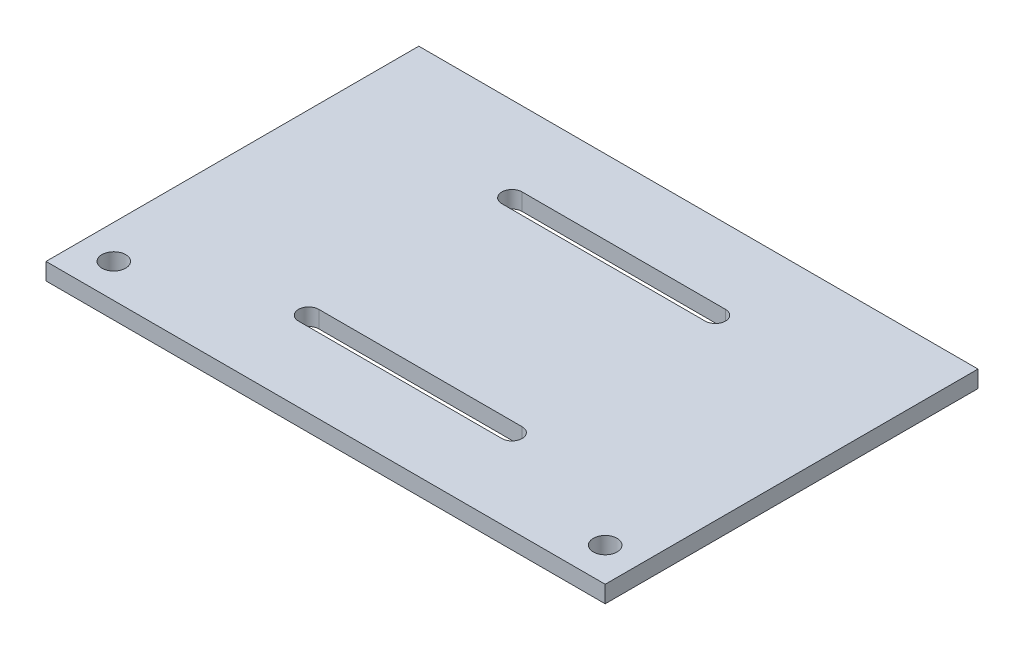
ISO-10303-21;
HEADER;
FILE_DESCRIPTION(('STEP AP214'),'2;1');
FILE_NAME('part.step','',(''),(''),'','','');
FILE_SCHEMA(('AUTOMOTIVE_DESIGN { 1 0 10303 214 1 1 1 1 }'));
ENDSEC;
DATA;
#1=APPLICATION_CONTEXT('core data for automotive mechanical design processes');
#2=APPLICATION_PROTOCOL_DEFINITION('international standard','automotive_design',2000,#1);
#3=PRODUCT_CONTEXT('',#1,'mechanical');
#4=PRODUCT('Part','Part','',(#3));
#5=PRODUCT_RELATED_PRODUCT_CATEGORY('part','',(#4));
#6=PRODUCT_DEFINITION_FORMATION('','',#4);
#7=PRODUCT_DEFINITION_CONTEXT('part definition',#1,'design');
#8=PRODUCT_DEFINITION('design','',#6,#7);
#9=PRODUCT_DEFINITION_SHAPE('','',#8);
#10=(LENGTH_UNIT() NAMED_UNIT(*) SI_UNIT(.MILLI.,.METRE.));
#11=(NAMED_UNIT(*) PLANE_ANGLE_UNIT() SI_UNIT($,.RADIAN.));
#12=(NAMED_UNIT(*) SI_UNIT($,.STERADIAN.) SOLID_ANGLE_UNIT());
#13=UNCERTAINTY_MEASURE_WITH_UNIT(LENGTH_MEASURE(1.E-05),#10,'distance_accuracy_value','');
#14=(GEOMETRIC_REPRESENTATION_CONTEXT(3) GLOBAL_UNCERTAINTY_ASSIGNED_CONTEXT((#13)) GLOBAL_UNIT_ASSIGNED_CONTEXT((#10,
#11,#12)) REPRESENTATION_CONTEXT('',''));
#15=CARTESIAN_POINT('',(0.,0.,0.));
#16=DIRECTION('',(0.,0.,1.));
#17=DIRECTION('',(1.,0.,0.));
#18=AXIS2_PLACEMENT_3D('',#15,#16,#17);
#19=CARTESIAN_POINT('',(0.,5.,0.));
#20=DIRECTION('',(0.,1.,0.));
#21=DIRECTION('',(0.,0.,1.));
#22=AXIS2_PLACEMENT_3D('',#19,#20,#21);
#23=PLANE('',#22);
#24=CARTESIAN_POINT('',(72.5,5.,45.));
#25=DIRECTION('',(0.,1.,0.));
#26=DIRECTION('',(0.,0.,1.));
#27=AXIS2_PLACEMENT_3D('',#24,#25,#26);
#28=CIRCLE('',#27,3.50000000000001);
#29=CARTESIAN_POINT('',(72.5,5.,48.5));
#30=VERTEX_POINT('',#29);
#31=EDGE_CURVE('E230',#30,#30,#28,.T.);
#32=ORIENTED_EDGE('',*,*,#31,.F.);
#33=EDGE_LOOP('',(#32));
#34=FACE_BOUND('',#33,.T.);
#35=DIRECTION('',(0.,0.,-1.));
#36=VECTOR('',#35,1.);
#37=CARTESIAN_POINT('',(82.5,5.,-55.));
#38=LINE('',#37,#36);
#39=CARTESIAN_POINT('',(82.5,5.,55.));
#40=VERTEX_POINT('',#39);
#41=CARTESIAN_POINT('',(82.5,5.,-55.));
#42=VERTEX_POINT('',#41);
#43=EDGE_CURVE('E238',#40,#42,#38,.T.);
#44=ORIENTED_EDGE('',*,*,#43,.T.);
#45=DIRECTION('',(-1.,0.,0.));
#46=VECTOR('',#45,1.);
#47=CARTESIAN_POINT('',(82.5,5.,-55.));
#48=LINE('',#47,#46);
#49=CARTESIAN_POINT('',(-82.5,5.,-55.));
#50=VERTEX_POINT('',#49);
#51=EDGE_CURVE('E242',#42,#50,#48,.T.);
#52=ORIENTED_EDGE('',*,*,#51,.T.);
#53=DIRECTION('',(0.,0.,1.));
#54=VECTOR('',#53,1.);
#55=CARTESIAN_POINT('',(-82.5,5.,-55.));
#56=LINE('',#55,#54);
#57=CARTESIAN_POINT('',(-82.5,5.,55.));
#58=VERTEX_POINT('',#57);
#59=EDGE_CURVE('E246',#50,#58,#56,.T.);
#60=ORIENTED_EDGE('',*,*,#59,.T.);
#61=DIRECTION('',(1.,0.,0.));
#62=VECTOR('',#61,1.);
#63=CARTESIAN_POINT('',(-82.5,5.,55.));
#64=LINE('',#63,#62);
#65=EDGE_CURVE('E249',#58,#40,#64,.T.);
#66=ORIENTED_EDGE('',*,*,#65,.T.);
#67=EDGE_LOOP('',(#44,#52,#60,#66));
#68=FACE_BOUND('',#67,.T.);
#69=CARTESIAN_POINT('',(-72.5,5.,45.));
#70=DIRECTION('',(0.,1.,0.));
#71=DIRECTION('',(0.,0.,1.));
#72=AXIS2_PLACEMENT_3D('',#69,#70,#71);
#73=CIRCLE('',#72,3.50000000000001);
#74=CARTESIAN_POINT('',(-72.5,5.,48.5));
#75=VERTEX_POINT('',#74);
#76=EDGE_CURVE('E222',#75,#75,#73,.T.);
#77=ORIENTED_EDGE('',*,*,#76,.F.);
#78=EDGE_LOOP('',(#77));
#79=FACE_BOUND('',#78,.T.);
#80=DIRECTION('',(-1.,0.,0.));
#81=VECTOR('',#80,1.);
#82=CARTESIAN_POINT('',(30.,5.,27.));
#83=LINE('',#82,#81);
#84=CARTESIAN_POINT('',(30.,5.,27.));
#85=VERTEX_POINT('',#84);
#86=CARTESIAN_POINT('',(-30.,5.,27.));
#87=VERTEX_POINT('',#86);
#88=EDGE_CURVE('E182',#85,#87,#83,.T.);
#89=ORIENTED_EDGE('',*,*,#88,.F.);
#90=CARTESIAN_POINT('',(30.,5.,30.));
#91=DIRECTION('',(0.,1.,0.));
#92=DIRECTION('',(0.,0.,1.));
#93=AXIS2_PLACEMENT_3D('',#90,#91,#92);
#94=CIRCLE('',#93,3.);
#95=CARTESIAN_POINT('',(30.,5.,33.));
#96=VERTEX_POINT('',#95);
#97=EDGE_CURVE('E179',#96,#85,#94,.T.);
#98=ORIENTED_EDGE('',*,*,#97,.F.);
#99=DIRECTION('',(1.,0.,0.));
#100=VECTOR('',#99,1.);
#101=CARTESIAN_POINT('',(30.,5.,33.));
#102=LINE('',#101,#100);
#103=CARTESIAN_POINT('',(-30.,5.,33.));
#104=VERTEX_POINT('',#103);
#105=EDGE_CURVE('E190',#104,#96,#102,.T.);
#106=ORIENTED_EDGE('',*,*,#105,.F.);
#107=CARTESIAN_POINT('',(-30.,5.,30.));
#108=DIRECTION('',(0.,1.,0.));
#109=DIRECTION('',(0.,0.,1.));
#110=AXIS2_PLACEMENT_3D('',#107,#108,#109);
#111=CIRCLE('',#110,3.);
#112=EDGE_CURVE('E186',#87,#104,#111,.T.);
#113=ORIENTED_EDGE('',*,*,#112,.F.);
#114=EDGE_LOOP('',(#89,#98,#106,#113));
#115=FACE_BOUND('',#114,.T.);
#116=DIRECTION('',(-1.,0.,0.));
#117=VECTOR('',#116,1.);
#118=CARTESIAN_POINT('',(30.,5.,-33.));
#119=LINE('',#118,#117);
#120=CARTESIAN_POINT('',(30.,5.,-33.));
#121=VERTEX_POINT('',#120);
#122=CARTESIAN_POINT('',(-30.,5.,-33.));
#123=VERTEX_POINT('',#122);
#124=EDGE_CURVE('E140',#121,#123,#119,.T.);
#125=ORIENTED_EDGE('',*,*,#124,.F.);
#126=CARTESIAN_POINT('',(30.,5.,-30.));
#127=DIRECTION('',(0.,1.,0.));
#128=DIRECTION('',(0.,0.,1.));
#129=AXIS2_PLACEMENT_3D('',#126,#127,#128);
#130=CIRCLE('',#129,3.00000000000001);
#131=CARTESIAN_POINT('',(30.,5.,-27.));
#132=VERTEX_POINT('',#131);
#133=EDGE_CURVE('E131',#132,#121,#130,.T.);
#134=ORIENTED_EDGE('',*,*,#133,.F.);
#135=DIRECTION('',(1.,0.,0.));
#136=VECTOR('',#135,1.);
#137=CARTESIAN_POINT('',(30.,5.,-27.));
#138=LINE('',#137,#136);
#139=CARTESIAN_POINT('',(-30.,5.,-27.));
#140=VERTEX_POINT('',#139);
#141=EDGE_CURVE('E157',#140,#132,#138,.T.);
#142=ORIENTED_EDGE('',*,*,#141,.F.);
#143=CARTESIAN_POINT('',(-30.,5.,-30.));
#144=DIRECTION('',(0.,1.,0.));
#145=DIRECTION('',(0.,0.,1.));
#146=AXIS2_PLACEMENT_3D('',#143,#144,#145);
#147=CIRCLE('',#146,3.00000000000001);
#148=EDGE_CURVE('E153',#123,#140,#147,.T.);
#149=ORIENTED_EDGE('',*,*,#148,.F.);
#150=EDGE_LOOP('',(#125,#134,#142,#149));
#151=FACE_BOUND('',#150,.T.);
#152=ADVANCED_FACE('F41',(#34,#68,#79,#115,#151),#23,.T.);
#153=CARTESIAN_POINT('',(0.,0.,0.));
#154=DIRECTION('',(0.,1.,0.));
#155=DIRECTION('',(0.,0.,1.));
#156=AXIS2_PLACEMENT_3D('',#153,#154,#155);
#157=PLANE('',#156);
#158=CARTESIAN_POINT('',(30.,0.,30.));
#159=DIRECTION('',(0.,1.,0.));
#160=DIRECTION('',(0.,0.,1.));
#161=AXIS2_PLACEMENT_3D('',#158,#159,#160);
#162=CIRCLE('',#161,3.);
#163=CARTESIAN_POINT('',(30.,0.,33.));
#164=VERTEX_POINT('',#163);
#165=CARTESIAN_POINT('',(30.,0.,27.));
#166=VERTEX_POINT('',#165);
#167=EDGE_CURVE('E149',#164,#166,#162,.T.);
#168=ORIENTED_EDGE('',*,*,#167,.T.);
#169=DIRECTION('',(-1.,0.,0.));
#170=VECTOR('',#169,1.);
#171=CARTESIAN_POINT('',(30.,0.,27.));
#172=LINE('',#171,#170);
#173=CARTESIAN_POINT('',(-30.,0.,27.));
#174=VERTEX_POINT('',#173);
#175=EDGE_CURVE('E197',#166,#174,#172,.T.);
#176=ORIENTED_EDGE('',*,*,#175,.T.);
#177=CARTESIAN_POINT('',(-30.,0.,30.));
#178=DIRECTION('',(0.,1.,0.));
#179=DIRECTION('',(0.,0.,1.));
#180=AXIS2_PLACEMENT_3D('',#177,#178,#179);
#181=CIRCLE('',#180,3.);
#182=CARTESIAN_POINT('',(-30.,0.,33.));
#183=VERTEX_POINT('',#182);
#184=EDGE_CURVE('E201',#174,#183,#181,.T.);
#185=ORIENTED_EDGE('',*,*,#184,.T.);
#186=DIRECTION('',(1.,0.,0.));
#187=VECTOR('',#186,1.);
#188=CARTESIAN_POINT('',(30.,0.,33.));
#189=LINE('',#188,#187);
#190=EDGE_CURVE('E183',#183,#164,#189,.T.);
#191=ORIENTED_EDGE('',*,*,#190,.T.);
#192=EDGE_LOOP('',(#168,#176,#185,#191));
#193=FACE_BOUND('',#192,.T.);
#194=DIRECTION('',(0.,0.,-1.));
#195=VECTOR('',#194,1.);
#196=CARTESIAN_POINT('',(82.5,0.,-55.));
#197=LINE('',#196,#195);
#198=CARTESIAN_POINT('',(82.5,0.,55.));
#199=VERTEX_POINT('',#198);
#200=CARTESIAN_POINT('',(82.5,0.,-55.));
#201=VERTEX_POINT('',#200);
#202=EDGE_CURVE('E234',#199,#201,#197,.T.);
#203=ORIENTED_EDGE('',*,*,#202,.F.);
#204=DIRECTION('',(1.,0.,0.));
#205=VECTOR('',#204,1.);
#206=CARTESIAN_POINT('',(-82.5,0.,55.));
#207=LINE('',#206,#205);
#208=CARTESIAN_POINT('',(-82.5,0.,55.));
#209=VERTEX_POINT('',#208);
#210=EDGE_CURVE('E243',#209,#199,#207,.T.);
#211=ORIENTED_EDGE('',*,*,#210,.F.);
#212=DIRECTION('',(0.,0.,1.));
#213=VECTOR('',#212,1.);
#214=CARTESIAN_POINT('',(-82.5,0.,-55.));
#215=LINE('',#214,#213);
#216=CARTESIAN_POINT('',(-82.5,0.,-55.));
#217=VERTEX_POINT('',#216);
#218=EDGE_CURVE('E259',#217,#209,#215,.T.);
#219=ORIENTED_EDGE('',*,*,#218,.F.);
#220=DIRECTION('',(-1.,0.,0.));
#221=VECTOR('',#220,1.);
#222=CARTESIAN_POINT('',(82.5,0.,-55.));
#223=LINE('',#222,#221);
#224=EDGE_CURVE('E256',#201,#217,#223,.T.);
#225=ORIENTED_EDGE('',*,*,#224,.F.);
#226=EDGE_LOOP('',(#203,#211,#219,#225));
#227=FACE_BOUND('',#226,.T.);
#228=CARTESIAN_POINT('',(72.5,0.,45.));
#229=DIRECTION('',(0.,1.,0.));
#230=DIRECTION('',(0.,0.,1.));
#231=AXIS2_PLACEMENT_3D('',#228,#229,#230);
#232=CIRCLE('',#231,3.50000000000001);
#233=CARTESIAN_POINT('',(72.5,0.,48.5));
#234=VERTEX_POINT('',#233);
#235=EDGE_CURVE('E226',#234,#234,#232,.T.);
#236=ORIENTED_EDGE('',*,*,#235,.T.);
#237=EDGE_LOOP('',(#236));
#238=FACE_BOUND('',#237,.T.);
#239=CARTESIAN_POINT('',(-72.5,0.,45.));
#240=DIRECTION('',(0.,1.,0.));
#241=DIRECTION('',(0.,0.,1.));
#242=AXIS2_PLACEMENT_3D('',#239,#240,#241);
#243=CIRCLE('',#242,3.50000000000001);
#244=CARTESIAN_POINT('',(-72.5,0.,48.5));
#245=VERTEX_POINT('',#244);
#246=EDGE_CURVE('E221',#245,#245,#243,.T.);
#247=ORIENTED_EDGE('',*,*,#246,.T.);
#248=EDGE_LOOP('',(#247));
#249=FACE_BOUND('',#248,.T.);
#250=CARTESIAN_POINT('',(30.,0.,-30.));
#251=DIRECTION('',(0.,1.,0.));
#252=DIRECTION('',(0.,0.,1.));
#253=AXIS2_PLACEMENT_3D('',#250,#251,#252);
#254=CIRCLE('',#253,3.00000000000001);
#255=CARTESIAN_POINT('',(30.,0.,-27.));
#256=VERTEX_POINT('',#255);
#257=CARTESIAN_POINT('',(30.,0.,-33.));
#258=VERTEX_POINT('',#257);
#259=EDGE_CURVE('E65',#256,#258,#254,.T.);
#260=ORIENTED_EDGE('',*,*,#259,.T.);
#261=DIRECTION('',(-1.,0.,0.));
#262=VECTOR('',#261,1.);
#263=CARTESIAN_POINT('',(30.,0.,-33.));
#264=LINE('',#263,#262);
#265=CARTESIAN_POINT('',(-30.,0.,-33.));
#266=VERTEX_POINT('',#265);
#267=EDGE_CURVE('E147',#258,#266,#264,.T.);
#268=ORIENTED_EDGE('',*,*,#267,.T.);
#269=CARTESIAN_POINT('',(-30.,0.,-30.));
#270=DIRECTION('',(0.,1.,0.));
#271=DIRECTION('',(0.,0.,1.));
#272=AXIS2_PLACEMENT_3D('',#269,#270,#271);
#273=CIRCLE('',#272,3.00000000000001);
#274=CARTESIAN_POINT('',(-30.,0.,-27.));
#275=VERTEX_POINT('',#274);
#276=EDGE_CURVE('E166',#266,#275,#273,.T.);
#277=ORIENTED_EDGE('',*,*,#276,.T.);
#278=DIRECTION('',(1.,0.,0.));
#279=VECTOR('',#278,1.);
#280=CARTESIAN_POINT('',(30.,0.,-27.));
#281=LINE('',#280,#279);
#282=EDGE_CURVE('E141',#275,#256,#281,.T.);
#283=ORIENTED_EDGE('',*,*,#282,.T.);
#284=EDGE_LOOP('',(#260,#268,#277,#283));
#285=FACE_BOUND('',#284,.T.);
#286=ADVANCED_FACE('F282',(#193,#227,#238,#249,#285),#157,.F.);
#287=CARTESIAN_POINT('',(82.5,5.,-55.));
#288=DIRECTION('',(-1.,0.,0.));
#289=DIRECTION('',(0.,0.,1.));
#290=AXIS2_PLACEMENT_3D('',#287,#288,#289);
#291=PLANE('',#290);
#292=ORIENTED_EDGE('',*,*,#202,.T.);
#293=DIRECTION('',(0.,-1.,0.));
#294=VECTOR('',#293,1.);
#295=CARTESIAN_POINT('',(82.5,5.,-55.));
#296=LINE('',#295,#294);
#297=EDGE_CURVE('E11',#42,#201,#296,.T.);
#298=ORIENTED_EDGE('',*,*,#297,.F.);
#299=ORIENTED_EDGE('',*,*,#43,.F.);
#300=DIRECTION('',(0.,-1.,0.));
#301=VECTOR('',#300,1.);
#302=CARTESIAN_POINT('',(82.5,5.,55.));
#303=LINE('',#302,#301);
#304=EDGE_CURVE('E252',#40,#199,#303,.T.);
#305=ORIENTED_EDGE('',*,*,#304,.T.);
#306=EDGE_LOOP('',(#292,#298,#299,#305));
#307=FACE_BOUND('',#306,.T.);
#308=ADVANCED_FACE('F43',(#307),#291,.F.);
#309=CARTESIAN_POINT('',(82.5,5.,-55.));
#310=DIRECTION('',(0.,0.,1.));
#311=DIRECTION('',(1.,0.,0.));
#312=AXIS2_PLACEMENT_3D('',#309,#310,#311);
#313=PLANE('',#312);
#314=ORIENTED_EDGE('',*,*,#224,.T.);
#315=DIRECTION('',(0.,-1.,0.));
#316=VECTOR('',#315,1.);
#317=CARTESIAN_POINT('',(-82.5,5.,-55.));
#318=LINE('',#317,#316);
#319=EDGE_CURVE('E50',#50,#217,#318,.T.);
#320=ORIENTED_EDGE('',*,*,#319,.F.);
#321=ORIENTED_EDGE('',*,*,#51,.F.);
#322=ORIENTED_EDGE('',*,*,#297,.T.);
#323=EDGE_LOOP('',(#314,#320,#321,#322));
#324=FACE_BOUND('',#323,.T.);
#325=ADVANCED_FACE('F293',(#324),#313,.F.);
#326=CARTESIAN_POINT('',(-82.5,5.,-55.));
#327=DIRECTION('',(1.,0.,0.));
#328=DIRECTION('',(0.,0.,-1.));
#329=AXIS2_PLACEMENT_3D('',#326,#327,#328);
#330=PLANE('',#329);
#331=ORIENTED_EDGE('',*,*,#218,.T.);
#332=DIRECTION('',(0.,-1.,0.));
#333=VECTOR('',#332,1.);
#334=CARTESIAN_POINT('',(-82.5,5.,55.));
#335=LINE('',#334,#333);
#336=EDGE_CURVE('E267',#58,#209,#335,.T.);
#337=ORIENTED_EDGE('',*,*,#336,.F.);
#338=ORIENTED_EDGE('',*,*,#59,.F.);
#339=ORIENTED_EDGE('',*,*,#319,.T.);
#340=EDGE_LOOP('',(#331,#337,#338,#339));
#341=FACE_BOUND('',#340,.T.);
#342=ADVANCED_FACE('F276',(#341),#330,.F.);
#343=CARTESIAN_POINT('',(-82.5,5.,55.));
#344=DIRECTION('',(0.,0.,-1.));
#345=DIRECTION('',(-1.,0.,0.));
#346=AXIS2_PLACEMENT_3D('',#343,#344,#345);
#347=PLANE('',#346);
#348=ORIENTED_EDGE('',*,*,#210,.T.);
#349=ORIENTED_EDGE('',*,*,#304,.F.);
#350=ORIENTED_EDGE('',*,*,#65,.F.);
#351=ORIENTED_EDGE('',*,*,#336,.T.);
#352=EDGE_LOOP('',(#348,#349,#350,#351));
#353=FACE_BOUND('',#352,.T.);
#354=ADVANCED_FACE('F286',(#353),#347,.F.);
#355=CARTESIAN_POINT('',(72.5,5.,45.));
#356=DIRECTION('',(0.,-1.,0.));
#357=DIRECTION('',(0.,0.,-1.));
#358=AXIS2_PLACEMENT_3D('',#355,#356,#357);
#359=CYLINDRICAL_SURFACE('',#358,3.50000000000001);
#360=ORIENTED_EDGE('',*,*,#31,.T.);
#361=EDGE_LOOP('',(#360));
#362=FACE_BOUND('',#361,.T.);
#363=ORIENTED_EDGE('',*,*,#235,.F.);
#364=EDGE_LOOP('',(#363));
#365=FACE_BOUND('',#364,.T.);
#366=ADVANCED_FACE('F310',(#362,#365),#359,.F.);
#367=CARTESIAN_POINT('',(-72.5,5.,45.));
#368=DIRECTION('',(0.,-1.,0.));
#369=DIRECTION('',(0.,0.,-1.));
#370=AXIS2_PLACEMENT_3D('',#367,#368,#369);
#371=CYLINDRICAL_SURFACE('',#370,3.50000000000001);
#372=ORIENTED_EDGE('',*,*,#76,.T.);
#373=EDGE_LOOP('',(#372));
#374=FACE_BOUND('',#373,.T.);
#375=ORIENTED_EDGE('',*,*,#246,.F.);
#376=EDGE_LOOP('',(#375));
#377=FACE_BOUND('',#376,.T.);
#378=ADVANCED_FACE('F317',(#374,#377),#371,.F.);
#379=CARTESIAN_POINT('',(30.,5.,30.));
#380=DIRECTION('',(0.,-1.,0.));
#381=DIRECTION('',(0.,0.,-1.));
#382=AXIS2_PLACEMENT_3D('',#379,#380,#381);
#383=CYLINDRICAL_SURFACE('',#382,3.);
#384=ORIENTED_EDGE('',*,*,#167,.F.);
#385=DIRECTION('',(0.,-1.,0.));
#386=VECTOR('',#385,1.);
#387=CARTESIAN_POINT('',(30.,5.,33.));
#388=LINE('',#387,#386);
#389=EDGE_CURVE('E193',#96,#164,#388,.T.);
#390=ORIENTED_EDGE('',*,*,#389,.F.);
#391=ORIENTED_EDGE('',*,*,#97,.T.);
#392=DIRECTION('',(0.,-1.,0.));
#393=VECTOR('',#392,1.);
#394=CARTESIAN_POINT('',(30.,5.,27.));
#395=LINE('',#394,#393);
#396=EDGE_CURVE('E217',#85,#166,#395,.T.);
#397=ORIENTED_EDGE('',*,*,#396,.T.);
#398=EDGE_LOOP('',(#384,#390,#391,#397));
#399=FACE_BOUND('',#398,.T.);
#400=ADVANCED_FACE('F322',(#399),#383,.F.);
#401=CARTESIAN_POINT('',(30.,5.,27.));
#402=DIRECTION('',(0.,0.,1.));
#403=DIRECTION('',(1.,0.,0.));
#404=AXIS2_PLACEMENT_3D('',#401,#402,#403);
#405=PLANE('',#404);
#406=ORIENTED_EDGE('',*,*,#175,.F.);
#407=ORIENTED_EDGE('',*,*,#396,.F.);
#408=ORIENTED_EDGE('',*,*,#88,.T.);
#409=DIRECTION('',(0.,-1.,0.));
#410=VECTOR('',#409,1.);
#411=CARTESIAN_POINT('',(-30.,5.,27.));
#412=LINE('',#411,#410);
#413=EDGE_CURVE('E214',#87,#174,#412,.T.);
#414=ORIENTED_EDGE('',*,*,#413,.T.);
#415=EDGE_LOOP('',(#406,#407,#408,#414));
#416=FACE_BOUND('',#415,.T.);
#417=ADVANCED_FACE('F351',(#416),#405,.T.);
#418=CARTESIAN_POINT('',(-30.,5.,30.));
#419=DIRECTION('',(0.,-1.,0.));
#420=DIRECTION('',(0.,0.,-1.));
#421=AXIS2_PLACEMENT_3D('',#418,#419,#420);
#422=CYLINDRICAL_SURFACE('',#421,3.);
#423=ORIENTED_EDGE('',*,*,#184,.F.);
#424=ORIENTED_EDGE('',*,*,#413,.F.);
#425=ORIENTED_EDGE('',*,*,#112,.T.);
#426=DIRECTION('',(0.,-1.,0.));
#427=VECTOR('',#426,1.);
#428=CARTESIAN_POINT('',(-30.,5.,33.));
#429=LINE('',#428,#427);
#430=EDGE_CURVE('E211',#104,#183,#429,.T.);
#431=ORIENTED_EDGE('',*,*,#430,.T.);
#432=EDGE_LOOP('',(#423,#424,#425,#431));
#433=FACE_BOUND('',#432,.T.);
#434=ADVANCED_FACE('F347',(#433),#422,.F.);
#435=CARTESIAN_POINT('',(30.,5.,33.));
#436=DIRECTION('',(0.,0.,-1.));
#437=DIRECTION('',(-1.,0.,0.));
#438=AXIS2_PLACEMENT_3D('',#435,#436,#437);
#439=PLANE('',#438);
#440=ORIENTED_EDGE('',*,*,#190,.F.);
#441=ORIENTED_EDGE('',*,*,#430,.F.);
#442=ORIENTED_EDGE('',*,*,#105,.T.);
#443=ORIENTED_EDGE('',*,*,#389,.T.);
#444=EDGE_LOOP('',(#440,#441,#442,#443));
#445=FACE_BOUND('',#444,.T.);
#446=ADVANCED_FACE('F344',(#445),#439,.T.);
#447=CARTESIAN_POINT('',(30.,5.,-30.));
#448=DIRECTION('',(0.,-1.,0.));
#449=DIRECTION('',(0.,0.,-1.));
#450=AXIS2_PLACEMENT_3D('',#447,#448,#449);
#451=CYLINDRICAL_SURFACE('',#450,3.00000000000001);
#452=ORIENTED_EDGE('',*,*,#259,.F.);
#453=DIRECTION('',(0.,-1.,0.));
#454=VECTOR('',#453,1.);
#455=CARTESIAN_POINT('',(30.,5.,-27.));
#456=LINE('',#455,#454);
#457=EDGE_CURVE('E135',#132,#256,#456,.T.);
#458=ORIENTED_EDGE('',*,*,#457,.F.);
#459=ORIENTED_EDGE('',*,*,#133,.T.);
#460=DIRECTION('',(0.,-1.,0.));
#461=VECTOR('',#460,1.);
#462=CARTESIAN_POINT('',(30.,5.,-33.));
#463=LINE('',#462,#461);
#464=EDGE_CURVE('E134',#121,#258,#463,.T.);
#465=ORIENTED_EDGE('',*,*,#464,.T.);
#466=EDGE_LOOP('',(#452,#458,#459,#465));
#467=FACE_BOUND('',#466,.T.);
#468=ADVANCED_FACE('F133',(#467),#451,.F.);
#469=CARTESIAN_POINT('',(30.,5.,-33.));
#470=DIRECTION('',(0.,0.,1.));
#471=DIRECTION('',(1.,0.,0.));
#472=AXIS2_PLACEMENT_3D('',#469,#470,#471);
#473=PLANE('',#472);
#474=ORIENTED_EDGE('',*,*,#267,.F.);
#475=ORIENTED_EDGE('',*,*,#464,.F.);
#476=ORIENTED_EDGE('',*,*,#124,.T.);
#477=DIRECTION('',(0.,-1.,0.));
#478=VECTOR('',#477,1.);
#479=CARTESIAN_POINT('',(-30.,5.,-33.));
#480=LINE('',#479,#478);
#481=EDGE_CURVE('E150',#123,#266,#480,.T.);
#482=ORIENTED_EDGE('',*,*,#481,.T.);
#483=EDGE_LOOP('',(#474,#475,#476,#482));
#484=FACE_BOUND('',#483,.T.);
#485=ADVANCED_FACE('F144',(#484),#473,.T.);
#486=CARTESIAN_POINT('',(-30.,5.,-30.));
#487=DIRECTION('',(0.,-1.,0.));
#488=DIRECTION('',(0.,0.,-1.));
#489=AXIS2_PLACEMENT_3D('',#486,#487,#488);
#490=CYLINDRICAL_SURFACE('',#489,3.00000000000001);
#491=ORIENTED_EDGE('',*,*,#276,.F.);
#492=ORIENTED_EDGE('',*,*,#481,.F.);
#493=ORIENTED_EDGE('',*,*,#148,.T.);
#494=DIRECTION('',(0.,-1.,0.));
#495=VECTOR('',#494,1.);
#496=CARTESIAN_POINT('',(-30.,5.,-27.));
#497=LINE('',#496,#495);
#498=EDGE_CURVE('E57',#140,#275,#497,.T.);
#499=ORIENTED_EDGE('',*,*,#498,.T.);
#500=EDGE_LOOP('',(#491,#492,#493,#499));
#501=FACE_BOUND('',#500,.T.);
#502=ADVANCED_FACE('F332',(#501),#490,.F.);
#503=CARTESIAN_POINT('',(30.,5.,-27.));
#504=DIRECTION('',(0.,0.,-1.));
#505=DIRECTION('',(-1.,0.,0.));
#506=AXIS2_PLACEMENT_3D('',#503,#504,#505);
#507=PLANE('',#506);
#508=ORIENTED_EDGE('',*,*,#282,.F.);
#509=ORIENTED_EDGE('',*,*,#498,.F.);
#510=ORIENTED_EDGE('',*,*,#141,.T.);
#511=ORIENTED_EDGE('',*,*,#457,.T.);
#512=EDGE_LOOP('',(#508,#509,#510,#511));
#513=FACE_BOUND('',#512,.T.);
#514=ADVANCED_FACE('F330',(#513),#507,.T.);
#515=CLOSED_SHELL('',(#152,#286,#308,#325,#342,#354,#366,#378,#400,#417,#434,#446,#468,#485,
#502,#514));
#516=MANIFOLD_SOLID_BREP('B2',#515);
#517=ADVANCED_BREP_SHAPE_REPRESENTATION('',(#18,#516),#14);
#518=SHAPE_DEFINITION_REPRESENTATION(#9,#517);
ENDSEC;
END-ISO-10303-21;
